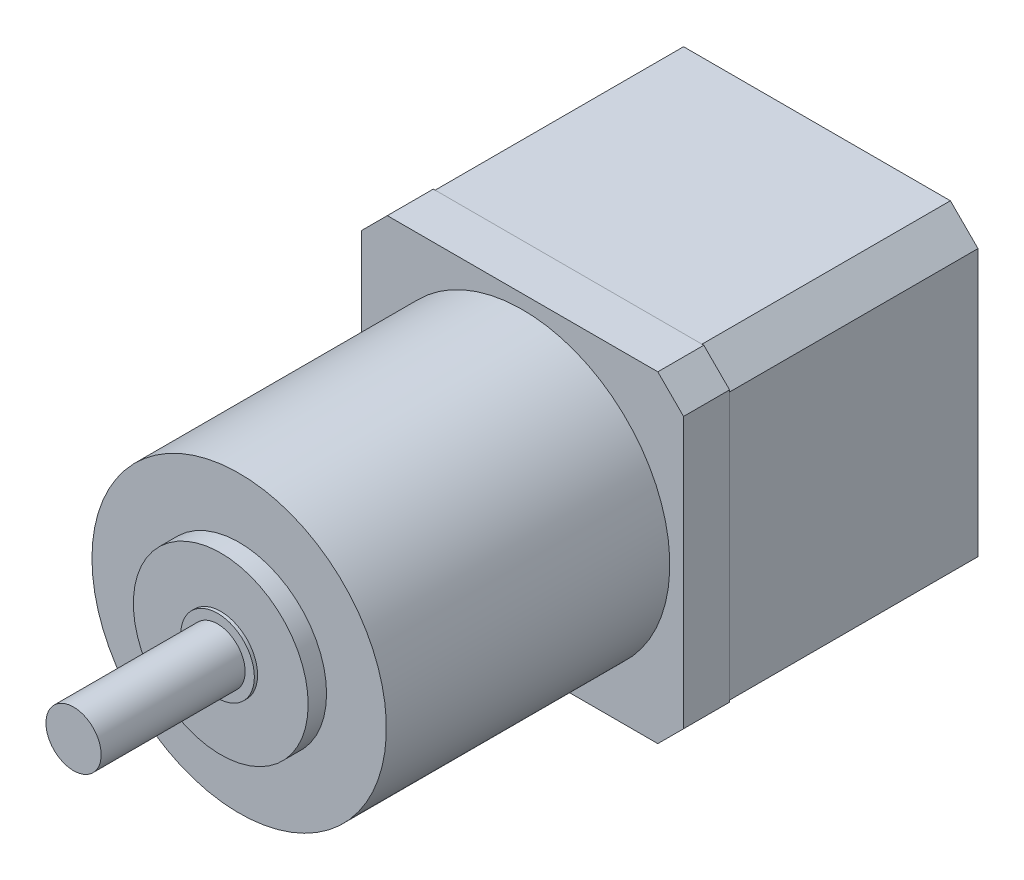
ISO-10303-21;
HEADER;
FILE_DESCRIPTION(('STEP AP214'),'2;1');
FILE_NAME('part.step','',(''),(''),'','','');
FILE_SCHEMA(('AUTOMOTIVE_DESIGN { 1 0 10303 214 1 1 1 1 }'));
ENDSEC;
DATA;
#1=APPLICATION_CONTEXT('core data for automotive mechanical design processes');
#2=APPLICATION_PROTOCOL_DEFINITION('international standard','automotive_design',2000,#1);
#3=PRODUCT_CONTEXT('',#1,'mechanical');
#4=PRODUCT('Part','Part','',(#3));
#5=PRODUCT_RELATED_PRODUCT_CATEGORY('part','',(#4));
#6=PRODUCT_DEFINITION_FORMATION('','',#4);
#7=PRODUCT_DEFINITION_CONTEXT('part definition',#1,'design');
#8=PRODUCT_DEFINITION('design','',#6,#7);
#9=PRODUCT_DEFINITION_SHAPE('','',#8);
#10=(LENGTH_UNIT() NAMED_UNIT(*) SI_UNIT(.MILLI.,.METRE.));
#11=(NAMED_UNIT(*) PLANE_ANGLE_UNIT() SI_UNIT($,.RADIAN.));
#12=(NAMED_UNIT(*) SI_UNIT($,.STERADIAN.) SOLID_ANGLE_UNIT());
#13=UNCERTAINTY_MEASURE_WITH_UNIT(LENGTH_MEASURE(1.E-05),#10,'distance_accuracy_value','');
#14=(GEOMETRIC_REPRESENTATION_CONTEXT(3) GLOBAL_UNCERTAINTY_ASSIGNED_CONTEXT((#13)) GLOBAL_UNIT_ASSIGNED_CONTEXT((#10,
#11,#12)) REPRESENTATION_CONTEXT('',''));
#15=CARTESIAN_POINT('',(0.,0.,0.));
#16=DIRECTION('',(0.,0.,1.));
#17=DIRECTION('',(1.,0.,0.));
#18=AXIS2_PLACEMENT_3D('',#15,#16,#17);
#19=CARTESIAN_POINT('',(17.5,-17.5,32.));
#20=DIRECTION('',(-1.,0.,0.));
#21=DIRECTION('',(0.,0.,1.));
#22=AXIS2_PLACEMENT_3D('',#19,#20,#21);
#23=PLANE('',#22);
#24=DIRECTION('',(0.,1.,0.));
#25=VECTOR('',#24,1.);
#26=CARTESIAN_POINT('',(17.5,-17.5,32.));
#27=LINE('',#26,#25);
#28=CARTESIAN_POINT('',(17.5,-14.7,32.));
#29=VERTEX_POINT('',#28);
#30=CARTESIAN_POINT('',(17.5,14.7,32.));
#31=VERTEX_POINT('',#30);
#32=EDGE_CURVE('E139',#29,#31,#27,.T.);
#33=ORIENTED_EDGE('',*,*,#32,.F.);
#34=DIRECTION('',(0.,0.,-1.));
#35=VECTOR('',#34,1.);
#36=CARTESIAN_POINT('',(17.5,-14.7,32.));
#37=LINE('',#36,#35);
#38=CARTESIAN_POINT('',(17.5,-14.7,27.));
#39=VERTEX_POINT('',#38);
#40=EDGE_CURVE('E165',#29,#39,#37,.T.);
#41=ORIENTED_EDGE('',*,*,#40,.T.);
#42=DIRECTION('',(0.,1.,0.));
#43=VECTOR('',#42,1.);
#44=CARTESIAN_POINT('',(17.5,-17.5,27.));
#45=LINE('',#44,#43);
#46=CARTESIAN_POINT('',(17.5,14.7,27.));
#47=VERTEX_POINT('',#46);
#48=EDGE_CURVE('E176',#39,#47,#45,.T.);
#49=ORIENTED_EDGE('',*,*,#48,.T.);
#50=DIRECTION('',(0.,0.,1.));
#51=VECTOR('',#50,1.);
#52=CARTESIAN_POINT('',(17.5,14.7,32.));
#53=LINE('',#52,#51);
#54=EDGE_CURVE('E163',#47,#31,#53,.T.);
#55=ORIENTED_EDGE('',*,*,#54,.T.);
#56=EDGE_LOOP('',(#33,#41,#49,#55));
#57=FACE_BOUND('',#56,.T.);
#58=ADVANCED_FACE('F46',(#57),#23,.F.);
#59=CARTESIAN_POINT('',(-17.5,17.5,32.));
#60=DIRECTION('',(0.,-1.,0.));
#61=DIRECTION('',(0.,0.,-1.));
#62=AXIS2_PLACEMENT_3D('',#59,#60,#61);
#63=PLANE('',#62);
#64=DIRECTION('',(-1.,0.,0.));
#65=VECTOR('',#64,1.);
#66=CARTESIAN_POINT('',(-17.5,17.5,27.));
#67=LINE('',#66,#65);
#68=CARTESIAN_POINT('',(14.7,17.5,27.));
#69=VERTEX_POINT('',#68);
#70=CARTESIAN_POINT('',(-14.7,17.5,27.));
#71=VERTEX_POINT('',#70);
#72=EDGE_CURVE('E144',#69,#71,#67,.T.);
#73=ORIENTED_EDGE('',*,*,#72,.T.);
#74=DIRECTION('',(0.,0.,1.));
#75=VECTOR('',#74,1.);
#76=CARTESIAN_POINT('',(-14.7,17.5,32.));
#77=LINE('',#76,#75);
#78=CARTESIAN_POINT('',(-14.7,17.5,32.));
#79=VERTEX_POINT('',#78);
#80=EDGE_CURVE('E55',#71,#79,#77,.T.);
#81=ORIENTED_EDGE('',*,*,#80,.T.);
#82=DIRECTION('',(-1.,0.,0.));
#83=VECTOR('',#82,1.);
#84=CARTESIAN_POINT('',(-17.5,17.5,32.));
#85=LINE('',#84,#83);
#86=CARTESIAN_POINT('',(14.7,17.5,32.));
#87=VERTEX_POINT('',#86);
#88=EDGE_CURVE('E142',#87,#79,#85,.T.);
#89=ORIENTED_EDGE('',*,*,#88,.F.);
#90=DIRECTION('',(0.,0.,-1.));
#91=VECTOR('',#90,1.);
#92=CARTESIAN_POINT('',(14.7,17.5,32.));
#93=LINE('',#92,#91);
#94=EDGE_CURVE('E168',#87,#69,#93,.T.);
#95=ORIENTED_EDGE('',*,*,#94,.T.);
#96=EDGE_LOOP('',(#73,#81,#89,#95));
#97=FACE_BOUND('',#96,.T.);
#98=ADVANCED_FACE('F173',(#97),#63,.F.);
#99=CARTESIAN_POINT('',(-17.5,-17.5,32.));
#100=DIRECTION('',(1.,0.,0.));
#101=DIRECTION('',(0.,0.,-1.));
#102=AXIS2_PLACEMENT_3D('',#99,#100,#101);
#103=PLANE('',#102);
#104=DIRECTION('',(0.,-1.,0.));
#105=VECTOR('',#104,1.);
#106=CARTESIAN_POINT('',(-17.5,-17.5,27.));
#107=LINE('',#106,#105);
#108=CARTESIAN_POINT('',(-17.5,14.7,27.));
#109=VERTEX_POINT('',#108);
#110=CARTESIAN_POINT('',(-17.5,-14.7,27.));
#111=VERTEX_POINT('',#110);
#112=EDGE_CURVE('E140',#109,#111,#107,.T.);
#113=ORIENTED_EDGE('',*,*,#112,.T.);
#114=DIRECTION('',(0.,0.,1.));
#115=VECTOR('',#114,1.);
#116=CARTESIAN_POINT('',(-17.5,-14.7,32.));
#117=LINE('',#116,#115);
#118=CARTESIAN_POINT('',(-17.5,-14.7,32.));
#119=VERTEX_POINT('',#118);
#120=EDGE_CURVE('E118',#111,#119,#117,.T.);
#121=ORIENTED_EDGE('',*,*,#120,.T.);
#122=DIRECTION('',(0.,-1.,0.));
#123=VECTOR('',#122,1.);
#124=CARTESIAN_POINT('',(-17.5,-17.5,32.));
#125=LINE('',#124,#123);
#126=CARTESIAN_POINT('',(-17.5,14.7,32.));
#127=VERTEX_POINT('',#126);
#128=EDGE_CURVE('E181',#127,#119,#125,.T.);
#129=ORIENTED_EDGE('',*,*,#128,.F.);
#130=DIRECTION('',(0.,0.,-1.));
#131=VECTOR('',#130,1.);
#132=CARTESIAN_POINT('',(-17.5,14.7,32.));
#133=LINE('',#132,#131);
#134=EDGE_CURVE('E123',#127,#109,#133,.T.);
#135=ORIENTED_EDGE('',*,*,#134,.T.);
#136=EDGE_LOOP('',(#113,#121,#129,#135));
#137=FACE_BOUND('',#136,.T.);
#138=ADVANCED_FACE('F229',(#137),#103,.F.);
#139=CARTESIAN_POINT('',(-17.5,-17.5,32.));
#140=DIRECTION('',(0.,1.,0.));
#141=DIRECTION('',(0.,0.,1.));
#142=AXIS2_PLACEMENT_3D('',#139,#140,#141);
#143=PLANE('',#142);
#144=DIRECTION('',(1.,0.,0.));
#145=VECTOR('',#144,1.);
#146=CARTESIAN_POINT('',(-17.5,-17.5,32.));
#147=LINE('',#146,#145);
#148=CARTESIAN_POINT('',(-14.7,-17.5,32.));
#149=VERTEX_POINT('',#148);
#150=CARTESIAN_POINT('',(14.7,-17.5,32.));
#151=VERTEX_POINT('',#150);
#152=EDGE_CURVE('E133',#149,#151,#147,.T.);
#153=ORIENTED_EDGE('',*,*,#152,.F.);
#154=DIRECTION('',(0.,0.,-1.));
#155=VECTOR('',#154,1.);
#156=CARTESIAN_POINT('',(-14.7,-17.5,32.));
#157=LINE('',#156,#155);
#158=CARTESIAN_POINT('',(-14.7,-17.5,27.));
#159=VERTEX_POINT('',#158);
#160=EDGE_CURVE('E117',#149,#159,#157,.T.);
#161=ORIENTED_EDGE('',*,*,#160,.T.);
#162=DIRECTION('',(1.,0.,0.));
#163=VECTOR('',#162,1.);
#164=CARTESIAN_POINT('',(-17.5,-17.5,27.));
#165=LINE('',#164,#163);
#166=CARTESIAN_POINT('',(14.7,-17.5,27.));
#167=VERTEX_POINT('',#166);
#168=EDGE_CURVE('E130',#159,#167,#165,.T.);
#169=ORIENTED_EDGE('',*,*,#168,.T.);
#170=DIRECTION('',(0.,0.,1.));
#171=VECTOR('',#170,1.);
#172=CARTESIAN_POINT('',(14.7,-17.5,32.));
#173=LINE('',#172,#171);
#174=EDGE_CURVE('E135',#167,#151,#173,.T.);
#175=ORIENTED_EDGE('',*,*,#174,.T.);
#176=EDGE_LOOP('',(#153,#161,#169,#175));
#177=FACE_BOUND('',#176,.T.);
#178=ADVANCED_FACE('F129',(#177),#143,.F.);
#179=CARTESIAN_POINT('',(0.,0.,32.));
#180=DIRECTION('',(0.,0.,-1.));
#181=DIRECTION('',(-1.,0.,0.));
#182=AXIS2_PLACEMENT_3D('',#179,#180,#181);
#183=PLANE('',#182);
#184=CARTESIAN_POINT('',(0.,0.,32.));
#185=DIRECTION('',(0.,0.,-1.));
#186=DIRECTION('',(-1.,0.,0.));
#187=AXIS2_PLACEMENT_3D('',#184,#185,#186);
#188=CIRCLE('',#187,16.);
#189=CARTESIAN_POINT('',(-16.,0.,32.));
#190=VERTEX_POINT('',#189);
#191=EDGE_CURVE('E12',#190,#190,#188,.F.);
#192=ORIENTED_EDGE('',*,*,#191,.F.);
#193=EDGE_LOOP('',(#192));
#194=FACE_BOUND('',#193,.T.);
#195=ORIENTED_EDGE('',*,*,#128,.T.);
#196=DIRECTION('',(-0.707106781186547,0.707106781186548,0.));
#197=VECTOR('',#196,1.);
#198=CARTESIAN_POINT('',(-14.7,-17.5,32.));
#199=LINE('',#198,#197);
#200=EDGE_CURVE('E161',#119,#149,#199,.F.);
#201=ORIENTED_EDGE('',*,*,#200,.T.);
#202=ORIENTED_EDGE('',*,*,#152,.T.);
#203=DIRECTION('',(-0.707106781186548,-0.707106781186547,0.));
#204=VECTOR('',#203,1.);
#205=CARTESIAN_POINT('',(17.5,-14.7,32.));
#206=LINE('',#205,#204);
#207=EDGE_CURVE('E159',#151,#29,#206,.F.);
#208=ORIENTED_EDGE('',*,*,#207,.T.);
#209=ORIENTED_EDGE('',*,*,#32,.T.);
#210=DIRECTION('',(0.707106781186547,-0.707106781186548,0.));
#211=VECTOR('',#210,1.);
#212=CARTESIAN_POINT('',(14.7,17.5,32.));
#213=LINE('',#212,#211);
#214=EDGE_CURVE('E68',#31,#87,#213,.F.);
#215=ORIENTED_EDGE('',*,*,#214,.T.);
#216=ORIENTED_EDGE('',*,*,#88,.T.);
#217=DIRECTION('',(0.707106781186548,0.707106781186547,0.));
#218=VECTOR('',#217,1.);
#219=CARTESIAN_POINT('',(-17.5,14.7,32.));
#220=LINE('',#219,#218);
#221=EDGE_CURVE('E157',#79,#127,#220,.F.);
#222=ORIENTED_EDGE('',*,*,#221,.T.);
#223=EDGE_LOOP('',(#195,#201,#202,#208,#209,#215,#216,#222));
#224=FACE_BOUND('',#223,.T.);
#225=ADVANCED_FACE('F249',(#194,#224),#183,.F.);
#226=CARTESIAN_POINT('',(0.,0.,27.));
#227=DIRECTION('',(0.,0.,-1.));
#228=DIRECTION('',(-1.,0.,0.));
#229=AXIS2_PLACEMENT_3D('',#226,#227,#228);
#230=PLANE('',#229);
#231=ORIENTED_EDGE('',*,*,#168,.F.);
#232=DIRECTION('',(0.707106781186547,-0.707106781186548,0.));
#233=VECTOR('',#232,1.);
#234=CARTESIAN_POINT('',(-16.1,-16.1,27.));
#235=LINE('',#234,#233);
#236=EDGE_CURVE('E113',#159,#111,#235,.F.);
#237=ORIENTED_EDGE('',*,*,#236,.T.);
#238=ORIENTED_EDGE('',*,*,#112,.F.);
#239=DIRECTION('',(-0.707106781186548,-0.707106781186547,0.));
#240=VECTOR('',#239,1.);
#241=CARTESIAN_POINT('',(-16.1,16.1,27.));
#242=LINE('',#241,#240);
#243=EDGE_CURVE('E150',#109,#71,#242,.F.);
#244=ORIENTED_EDGE('',*,*,#243,.T.);
#245=ORIENTED_EDGE('',*,*,#72,.F.);
#246=DIRECTION('',(-0.707106781186547,0.707106781186548,0.));
#247=VECTOR('',#246,1.);
#248=CARTESIAN_POINT('',(16.1,16.1,27.));
#249=LINE('',#248,#247);
#250=EDGE_CURVE('E134',#69,#47,#249,.F.);
#251=ORIENTED_EDGE('',*,*,#250,.T.);
#252=ORIENTED_EDGE('',*,*,#48,.F.);
#253=DIRECTION('',(0.707106781186548,0.707106781186547,0.));
#254=VECTOR('',#253,1.);
#255=CARTESIAN_POINT('',(16.1,-16.1,27.));
#256=LINE('',#255,#254);
#257=EDGE_CURVE('E124',#39,#167,#256,.F.);
#258=ORIENTED_EDGE('',*,*,#257,.T.);
#259=EDGE_LOOP('',(#231,#237,#238,#244,#245,#251,#252,#258));
#260=FACE_BOUND('',#259,.T.);
#261=ADVANCED_FACE('F137',(#260),#230,.T.);
#262=CARTESIAN_POINT('',(-14.7,-17.5,32.));
#263=DIRECTION('',(0.707106781186548,0.707106781186547,0.));
#264=DIRECTION('',(0.,0.,-1.));
#265=AXIS2_PLACEMENT_3D('',#262,#263,#264);
#266=PLANE('',#265);
#267=ORIENTED_EDGE('',*,*,#200,.F.);
#268=ORIENTED_EDGE('',*,*,#120,.F.);
#269=ORIENTED_EDGE('',*,*,#236,.F.);
#270=ORIENTED_EDGE('',*,*,#160,.F.);
#271=EDGE_LOOP('',(#267,#268,#269,#270));
#272=FACE_BOUND('',#271,.T.);
#273=ADVANCED_FACE('F116',(#272),#266,.F.);
#274=CARTESIAN_POINT('',(17.5,-14.7,32.));
#275=DIRECTION('',(-0.707106781186547,0.707106781186548,0.));
#276=DIRECTION('',(0.,0.,-1.));
#277=AXIS2_PLACEMENT_3D('',#274,#275,#276);
#278=PLANE('',#277);
#279=ORIENTED_EDGE('',*,*,#207,.F.);
#280=ORIENTED_EDGE('',*,*,#174,.F.);
#281=ORIENTED_EDGE('',*,*,#257,.F.);
#282=ORIENTED_EDGE('',*,*,#40,.F.);
#283=EDGE_LOOP('',(#279,#280,#281,#282));
#284=FACE_BOUND('',#283,.T.);
#285=ADVANCED_FACE('F236',(#284),#278,.F.);
#286=CARTESIAN_POINT('',(-17.5,14.7,32.));
#287=DIRECTION('',(0.707106781186547,-0.707106781186548,0.));
#288=DIRECTION('',(0.,0.,-1.));
#289=AXIS2_PLACEMENT_3D('',#286,#287,#288);
#290=PLANE('',#289);
#291=ORIENTED_EDGE('',*,*,#221,.F.);
#292=ORIENTED_EDGE('',*,*,#80,.F.);
#293=ORIENTED_EDGE('',*,*,#243,.F.);
#294=ORIENTED_EDGE('',*,*,#134,.F.);
#295=EDGE_LOOP('',(#291,#292,#293,#294));
#296=FACE_BOUND('',#295,.T.);
#297=ADVANCED_FACE('F238',(#296),#290,.F.);
#298=CARTESIAN_POINT('',(14.7,17.5,32.));
#299=DIRECTION('',(-0.707106781186548,-0.707106781186547,0.));
#300=DIRECTION('',(0.,0.,-1.));
#301=AXIS2_PLACEMENT_3D('',#298,#299,#300);
#302=PLANE('',#301);
#303=ORIENTED_EDGE('',*,*,#214,.F.);
#304=ORIENTED_EDGE('',*,*,#54,.F.);
#305=ORIENTED_EDGE('',*,*,#250,.F.);
#306=ORIENTED_EDGE('',*,*,#94,.F.);
#307=EDGE_LOOP('',(#303,#304,#305,#306));
#308=FACE_BOUND('',#307,.T.);
#309=ADVANCED_FACE('F48',(#308),#302,.F.);
#310=CARTESIAN_POINT('',(0.,0.,62.8));
#311=DIRECTION('',(0.,0.,-1.));
#312=DIRECTION('',(-1.,0.,0.));
#313=AXIS2_PLACEMENT_3D('',#310,#311,#312);
#314=CYLINDRICAL_SURFACE('',#313,16.);
#315=CARTESIAN_POINT('',(0.,0.,62.8));
#316=DIRECTION('',(0.,0.,1.));
#317=DIRECTION('',(1.,0.,0.));
#318=AXIS2_PLACEMENT_3D('',#315,#316,#317);
#319=CIRCLE('',#318,16.);
#320=CARTESIAN_POINT('',(-16.,0.,62.8));
#321=VERTEX_POINT('',#320);
#322=EDGE_CURVE('E177',#321,#321,#319,.T.);
#323=CARTESIAN_POINT('',(-16.,0.,62.8));
#324=CARTESIAN_POINT('',(-16.,0.,62.4791666666667));
#325=CARTESIAN_POINT('',(-16.,0.,62.1583333333333));
#326=CARTESIAN_POINT('',(-16.,0.,61.5166666666667));
#327=CARTESIAN_POINT('',(-16.,0.,61.1958333333333));
#328=CARTESIAN_POINT('',(-16.,0.,60.5541666666667));
#329=CARTESIAN_POINT('',(-16.,0.,60.2333333333333));
#330=CARTESIAN_POINT('',(-16.,0.,59.5916666666667));
#331=CARTESIAN_POINT('',(-16.,0.,59.2708333333333));
#332=CARTESIAN_POINT('',(-16.,0.,58.6291666666667));
#333=CARTESIAN_POINT('',(-16.,0.,58.3083333333333));
#334=CARTESIAN_POINT('',(-16.,0.,57.6666666666667));
#335=CARTESIAN_POINT('',(-16.,0.,57.3458333333333));
#336=CARTESIAN_POINT('',(-16.,0.,56.7041666666667));
#337=CARTESIAN_POINT('',(-16.,0.,56.3833333333333));
#338=CARTESIAN_POINT('',(-16.,0.,55.7416666666667));
#339=CARTESIAN_POINT('',(-16.,0.,55.4208333333333));
#340=CARTESIAN_POINT('',(-16.,0.,54.7791666666667));
#341=CARTESIAN_POINT('',(-16.,0.,54.4583333333333));
#342=CARTESIAN_POINT('',(-16.,0.,53.8166666666667));
#343=CARTESIAN_POINT('',(-16.,0.,53.4958333333333));
#344=CARTESIAN_POINT('',(-16.,0.,52.8541666666667));
#345=CARTESIAN_POINT('',(-16.,0.,52.5333333333333));
#346=CARTESIAN_POINT('',(-16.,0.,51.8916666666667));
#347=CARTESIAN_POINT('',(-16.,0.,51.5708333333333));
#348=CARTESIAN_POINT('',(-16.,0.,50.9291666666667));
#349=CARTESIAN_POINT('',(-16.,0.,50.6083333333333));
#350=CARTESIAN_POINT('',(-16.,0.,49.9666666666667));
#351=CARTESIAN_POINT('',(-16.,0.,49.6458333333333));
#352=CARTESIAN_POINT('',(-16.,0.,49.0041666666667));
#353=CARTESIAN_POINT('',(-16.,0.,48.6833333333333));
#354=CARTESIAN_POINT('',(-16.,0.,48.0416666666667));
#355=CARTESIAN_POINT('',(-16.,0.,47.7208333333333));
#356=CARTESIAN_POINT('',(-16.,0.,47.0791666666667));
#357=CARTESIAN_POINT('',(-16.,0.,46.7583333333333));
#358=CARTESIAN_POINT('',(-16.,0.,46.1166666666667));
#359=CARTESIAN_POINT('',(-16.,0.,45.7958333333333));
#360=CARTESIAN_POINT('',(-16.,0.,45.1541666666667));
#361=CARTESIAN_POINT('',(-16.,0.,44.8333333333333));
#362=CARTESIAN_POINT('',(-16.,0.,44.1916666666667));
#363=CARTESIAN_POINT('',(-16.,0.,43.8708333333333));
#364=CARTESIAN_POINT('',(-16.,0.,43.2291666666667));
#365=CARTESIAN_POINT('',(-16.,0.,42.9083333333333));
#366=CARTESIAN_POINT('',(-16.,0.,42.2666666666667));
#367=CARTESIAN_POINT('',(-16.,0.,41.9458333333333));
#368=CARTESIAN_POINT('',(-16.,0.,41.3041666666667));
#369=CARTESIAN_POINT('',(-16.,0.,40.9833333333333));
#370=CARTESIAN_POINT('',(-16.,0.,40.3416666666667));
#371=CARTESIAN_POINT('',(-16.,0.,40.0208333333333));
#372=CARTESIAN_POINT('',(-16.,0.,39.3791666666667));
#373=CARTESIAN_POINT('',(-16.,0.,39.0583333333333));
#374=CARTESIAN_POINT('',(-16.,0.,38.4166666666667));
#375=CARTESIAN_POINT('',(-16.,0.,38.0958333333333));
#376=CARTESIAN_POINT('',(-16.,0.,37.4541666666667));
#377=CARTESIAN_POINT('',(-16.,0.,37.1333333333333));
#378=CARTESIAN_POINT('',(-16.,0.,36.4916666666667));
#379=CARTESIAN_POINT('',(-16.,0.,36.1708333333333));
#380=CARTESIAN_POINT('',(-16.,0.,35.5291666666667));
#381=CARTESIAN_POINT('',(-16.,0.,35.2083333333333));
#382=CARTESIAN_POINT('',(-16.,0.,34.5666666666667));
#383=CARTESIAN_POINT('',(-16.,0.,34.2458333333333));
#384=CARTESIAN_POINT('',(-16.,0.,33.6041666666667));
#385=CARTESIAN_POINT('',(-16.,0.,33.2833333333333));
#386=CARTESIAN_POINT('',(-16.,0.,32.6416666666667));
#387=CARTESIAN_POINT('',(-16.,0.,32.3208333333333));
#388=CARTESIAN_POINT('',(-16.,0.,32.));
#389=B_SPLINE_CURVE_WITH_KNOTS('',3,(#323,#324,#325,#326,#327,#328,#329,#330,#331,#332,#333,
#334,#335,#336,#337,#338,#339,#340,#341,#342,#343,#344,#345,#346,#347,#348,#349,#350,#351,#352,
#353,#354,#355,#356,#357,#358,#359,#360,#361,#362,#363,#364,#365,#366,#367,#368,#369,#370,#371,
#372,#373,#374,#375,#376,#377,#378,#379,#380,#381,#382,#383,#384,#385,#386,#387,#388),
.UNSPECIFIED.,.F.,.F.,(4,2,2,2,2,2,2,2,2,2,2,2,2,2,2,2,2,2,2,2,2,2,2,2,2,2,2,2,2,2,2,2,4),(0.,
0.962500000000005,1.925,2.88750000000001,3.85000000000001,4.8125,5.775,6.7375,7.70000000000001,
8.6625,9.625,10.5875,11.55,12.5125,13.475,14.4375,15.4,16.3625,17.325,18.2875,19.25,20.2125,
21.175,22.1375,23.1,24.0625,25.025,25.9875,26.95,27.9125,28.875,29.8375,30.8),.UNSPECIFIED.);
#390=EDGE_CURVE('BSEAM245',#321,#190,#389,.T.);
#391=ORIENTED_EDGE('',*,*,#322,.F.);
#392=ORIENTED_EDGE('',*,*,#191,.T.);
#393=ORIENTED_EDGE('',*,*,#390,.T.);
#394=ORIENTED_EDGE('',*,*,#390,.F.);
#395=EDGE_LOOP('',(#391,#393,#392,#394));
#396=FACE_BOUND('',#395,.T.);
#397=ADVANCED_FACE('F245',(#396),#314,.T.);
#398=CARTESIAN_POINT('',(0.,0.,62.8));
#399=DIRECTION('',(0.,0.,1.));
#400=DIRECTION('',(1.,0.,0.));
#401=AXIS2_PLACEMENT_3D('',#398,#399,#400);
#402=PLANE('',#401);
#403=CARTESIAN_POINT('',(0.,0.,62.8));
#404=DIRECTION('',(0.,0.,1.));
#405=DIRECTION('',(1.,0.,0.));
#406=AXIS2_PLACEMENT_3D('',#403,#404,#405);
#407=CIRCLE('',#406,9.5);
#408=CARTESIAN_POINT('',(9.5,0.,62.8));
#409=VERTEX_POINT('',#408);
#410=EDGE_CURVE('E188',#409,#409,#407,.T.);
#411=ORIENTED_EDGE('',*,*,#410,.F.);
#412=EDGE_LOOP('',(#411));
#413=FACE_BOUND('',#412,.T.);
#414=ORIENTED_EDGE('',*,*,#322,.T.);
#415=EDGE_LOOP('',(#414));
#416=FACE_BOUND('',#415,.T.);
#417=ADVANCED_FACE('F264',(#413,#416),#402,.T.);
#418=CARTESIAN_POINT('',(0.,0.,64.8));
#419=DIRECTION('',(0.,0.,-1.));
#420=DIRECTION('',(-1.,0.,0.));
#421=AXIS2_PLACEMENT_3D('',#418,#419,#420);
#422=CYLINDRICAL_SURFACE('',#421,9.5);
#423=CARTESIAN_POINT('',(0.,0.,64.8));
#424=DIRECTION('',(0.,0.,1.));
#425=DIRECTION('',(1.,0.,0.));
#426=AXIS2_PLACEMENT_3D('',#423,#424,#425);
#427=CIRCLE('',#426,9.5);
#428=CARTESIAN_POINT('',(9.5,0.,64.8));
#429=VERTEX_POINT('',#428);
#430=EDGE_CURVE('E187',#429,#429,#427,.T.);
#431=ORIENTED_EDGE('',*,*,#430,.F.);
#432=EDGE_LOOP('',(#431));
#433=FACE_BOUND('',#432,.T.);
#434=ORIENTED_EDGE('',*,*,#410,.T.);
#435=EDGE_LOOP('',(#434));
#436=FACE_BOUND('',#435,.T.);
#437=ADVANCED_FACE('F268',(#433,#436),#422,.T.);
#438=CARTESIAN_POINT('',(0.,0.,64.8));
#439=DIRECTION('',(0.,0.,1.));
#440=DIRECTION('',(1.,0.,0.));
#441=AXIS2_PLACEMENT_3D('',#438,#439,#440);
#442=PLANE('',#441);
#443=CARTESIAN_POINT('',(0.,0.,64.8));
#444=DIRECTION('',(0.,0.,1.));
#445=DIRECTION('',(1.,0.,0.));
#446=AXIS2_PLACEMENT_3D('',#443,#444,#445);
#447=CIRCLE('',#446,4.);
#448=CARTESIAN_POINT('',(4.,0.,64.8));
#449=VERTEX_POINT('',#448);
#450=EDGE_CURVE('E196',#449,#449,#447,.T.);
#451=ORIENTED_EDGE('',*,*,#450,.F.);
#452=EDGE_LOOP('',(#451));
#453=FACE_BOUND('',#452,.T.);
#454=ORIENTED_EDGE('',*,*,#430,.T.);
#455=EDGE_LOOP('',(#454));
#456=FACE_BOUND('',#455,.T.);
#457=ADVANCED_FACE('F220',(#453,#456),#442,.T.);
#458=CARTESIAN_POINT('',(0.,0.,65.15));
#459=DIRECTION('',(0.,0.,-1.));
#460=DIRECTION('',(-1.,0.,0.));
#461=AXIS2_PLACEMENT_3D('',#458,#459,#460);
#462=CYLINDRICAL_SURFACE('',#461,4.);
#463=CARTESIAN_POINT('',(0.,0.,65.15));
#464=DIRECTION('',(0.,0.,1.));
#465=DIRECTION('',(1.,0.,0.));
#466=AXIS2_PLACEMENT_3D('',#463,#464,#465);
#467=CIRCLE('',#466,4.);
#468=CARTESIAN_POINT('',(4.,0.,65.15));
#469=VERTEX_POINT('',#468);
#470=EDGE_CURVE('E199',#469,#469,#467,.T.);
#471=ORIENTED_EDGE('',*,*,#470,.F.);
#472=EDGE_LOOP('',(#471));
#473=FACE_BOUND('',#472,.T.);
#474=ORIENTED_EDGE('',*,*,#450,.T.);
#475=EDGE_LOOP('',(#474));
#476=FACE_BOUND('',#475,.T.);
#477=ADVANCED_FACE('F212',(#473,#476),#462,.T.);
#478=CARTESIAN_POINT('',(0.,0.,65.15));
#479=DIRECTION('',(0.,0.,1.));
#480=DIRECTION('',(1.,0.,0.));
#481=AXIS2_PLACEMENT_3D('',#478,#479,#480);
#482=PLANE('',#481);
#483=CARTESIAN_POINT('',(0.,0.,65.15));
#484=DIRECTION('',(0.,0.,1.));
#485=DIRECTION('',(1.,0.,0.));
#486=AXIS2_PLACEMENT_3D('',#483,#484,#485);
#487=CIRCLE('',#486,3.);
#488=CARTESIAN_POINT('',(3.,0.,65.15));
#489=VERTEX_POINT('',#488);
#490=EDGE_CURVE('E50',#489,#489,#487,.T.);
#491=ORIENTED_EDGE('',*,*,#490,.F.);
#492=EDGE_LOOP('',(#491));
#493=FACE_BOUND('',#492,.T.);
#494=ORIENTED_EDGE('',*,*,#470,.T.);
#495=EDGE_LOOP('',(#494));
#496=FACE_BOUND('',#495,.T.);
#497=ADVANCED_FACE('F209',(#493,#496),#482,.T.);
#498=CARTESIAN_POINT('',(0.,0.,80.8));
#499=DIRECTION('',(0.,0.,1.));
#500=DIRECTION('',(1.,0.,0.));
#501=AXIS2_PLACEMENT_3D('',#498,#499,#500);
#502=PLANE('',#501);
#503=CARTESIAN_POINT('',(0.,0.,80.8));
#504=DIRECTION('',(0.,0.,1.));
#505=DIRECTION('',(1.,0.,0.));
#506=AXIS2_PLACEMENT_3D('',#503,#504,#505);
#507=CIRCLE('',#506,3.);
#508=CARTESIAN_POINT('',(3.,0.,80.8));
#509=VERTEX_POINT('',#508);
#510=EDGE_CURVE('E191',#509,#509,#507,.T.);
#511=ORIENTED_EDGE('',*,*,#510,.T.);
#512=EDGE_LOOP('',(#511));
#513=FACE_BOUND('',#512,.T.);
#514=ADVANCED_FACE('F211',(#513),#502,.T.);
#515=CARTESIAN_POINT('',(0.,0.,80.8));
#516=DIRECTION('',(0.,0.,-1.));
#517=DIRECTION('',(-1.,0.,0.));
#518=AXIS2_PLACEMENT_3D('',#515,#516,#517);
#519=CYLINDRICAL_SURFACE('',#518,3.);
#520=ORIENTED_EDGE('',*,*,#490,.T.);
#521=EDGE_LOOP('',(#520));
#522=FACE_BOUND('',#521,.T.);
#523=ORIENTED_EDGE('',*,*,#510,.F.);
#524=EDGE_LOOP('',(#523));
#525=FACE_BOUND('',#524,.T.);
#526=ADVANCED_FACE('F206',(#522,#525),#519,.T.);
#527=CLOSED_SHELL('',(#58,#98,#138,#178,#225,#261,#273,#285,#297,#309,#397,#417,#437,#457,#477,
#497,#514,#526));
#528=MANIFOLD_SOLID_BREP('B2',#527);
#529=CARTESIAN_POINT('',(17.5,17.5,27.));
#530=DIRECTION('',(-1.,0.,0.));
#531=DIRECTION('',(0.,-1.,0.));
#532=AXIS2_PLACEMENT_3D('',#529,#530,#531);
#533=PLANE('',#532);
#534=DIRECTION('',(0.,1.,0.));
#535=VECTOR('',#534,1.);
#536=CARTESIAN_POINT('',(17.5,17.5,27.));
#537=LINE('',#536,#535);
#538=CARTESIAN_POINT('',(17.5,-14.5,27.));
#539=VERTEX_POINT('',#538);
#540=CARTESIAN_POINT('',(17.5,14.5,27.));
#541=VERTEX_POINT('',#540);
#542=EDGE_CURVE('E492',#539,#541,#537,.T.);
#543=ORIENTED_EDGE('',*,*,#542,.F.);
#544=DIRECTION('',(0.,0.,-1.));
#545=VECTOR('',#544,1.);
#546=CARTESIAN_POINT('',(17.5,-14.5,27.));
#547=LINE('',#546,#545);
#548=CARTESIAN_POINT('',(17.5,-14.5,0.));
#549=VERTEX_POINT('',#548);
#550=EDGE_CURVE('E518',#539,#549,#547,.T.);
#551=ORIENTED_EDGE('',*,*,#550,.T.);
#552=DIRECTION('',(0.,1.,0.));
#553=VECTOR('',#552,1.);
#554=CARTESIAN_POINT('',(17.5,17.5,0.));
#555=LINE('',#554,#553);
#556=CARTESIAN_POINT('',(17.5,14.5,0.));
#557=VERTEX_POINT('',#556);
#558=EDGE_CURVE('E526',#549,#557,#555,.T.);
#559=ORIENTED_EDGE('',*,*,#558,.T.);
#560=DIRECTION('',(0.,0.,1.));
#561=VECTOR('',#560,1.);
#562=CARTESIAN_POINT('',(17.5,14.5,27.));
#563=LINE('',#562,#561);
#564=EDGE_CURVE('E516',#557,#541,#563,.T.);
#565=ORIENTED_EDGE('',*,*,#564,.T.);
#566=EDGE_LOOP('',(#543,#551,#559,#565));
#567=FACE_BOUND('',#566,.T.);
#568=ADVANCED_FACE('F401',(#567),#533,.F.);
#569=CARTESIAN_POINT('',(-17.5,17.5,27.));
#570=DIRECTION('',(0.,-1.,0.));
#571=DIRECTION('',(0.,0.,-1.));
#572=AXIS2_PLACEMENT_3D('',#569,#570,#571);
#573=PLANE('',#572);
#574=DIRECTION('',(-1.,0.,0.));
#575=VECTOR('',#574,1.);
#576=CARTESIAN_POINT('',(-17.5,17.5,0.));
#577=LINE('',#576,#575);
#578=CARTESIAN_POINT('',(14.5,17.5,0.));
#579=VERTEX_POINT('',#578);
#580=CARTESIAN_POINT('',(-14.5,17.5,0.));
#581=VERTEX_POINT('',#580);
#582=EDGE_CURVE('E497',#579,#581,#577,.T.);
#583=ORIENTED_EDGE('',*,*,#582,.T.);
#584=DIRECTION('',(0.,0.,1.));
#585=VECTOR('',#584,1.);
#586=CARTESIAN_POINT('',(-14.5,17.5,27.));
#587=LINE('',#586,#585);
#588=CARTESIAN_POINT('',(-14.5,17.5,27.));
#589=VERTEX_POINT('',#588);
#590=EDGE_CURVE('E44',#581,#589,#587,.T.);
#591=ORIENTED_EDGE('',*,*,#590,.T.);
#592=DIRECTION('',(-1.,0.,0.));
#593=VECTOR('',#592,1.);
#594=CARTESIAN_POINT('',(-17.5,17.5,27.));
#595=LINE('',#594,#593);
#596=CARTESIAN_POINT('',(14.5,17.5,27.));
#597=VERTEX_POINT('',#596);
#598=EDGE_CURVE('E495',#597,#589,#595,.T.);
#599=ORIENTED_EDGE('',*,*,#598,.F.);
#600=DIRECTION('',(0.,0.,-1.));
#601=VECTOR('',#600,1.);
#602=CARTESIAN_POINT('',(14.5,17.5,27.));
#603=LINE('',#602,#601);
#604=EDGE_CURVE('E409',#597,#579,#603,.T.);
#605=ORIENTED_EDGE('',*,*,#604,.T.);
#606=EDGE_LOOP('',(#583,#591,#599,#605));
#607=FACE_BOUND('',#606,.T.);
#608=ADVANCED_FACE('F523',(#607),#573,.F.);
#609=CARTESIAN_POINT('',(-17.5,17.5,27.));
#610=DIRECTION('',(1.,0.,0.));
#611=DIRECTION('',(0.,1.,0.));
#612=AXIS2_PLACEMENT_3D('',#609,#610,#611);
#613=PLANE('',#612);
#614=DIRECTION('',(0.,-1.,0.));
#615=VECTOR('',#614,1.);
#616=CARTESIAN_POINT('',(-17.5,17.5,0.));
#617=LINE('',#616,#615);
#618=CARTESIAN_POINT('',(-17.5,14.5,0.));
#619=VERTEX_POINT('',#618);
#620=CARTESIAN_POINT('',(-17.5,-14.5,0.));
#621=VERTEX_POINT('',#620);
#622=EDGE_CURVE('E493',#619,#621,#617,.T.);
#623=ORIENTED_EDGE('',*,*,#622,.T.);
#624=DIRECTION('',(0.,0.,1.));
#625=VECTOR('',#624,1.);
#626=CARTESIAN_POINT('',(-17.5,-14.5,27.));
#627=LINE('',#626,#625);
#628=CARTESIAN_POINT('',(-17.5,-14.5,27.));
#629=VERTEX_POINT('',#628);
#630=EDGE_CURVE('E471',#621,#629,#627,.T.);
#631=ORIENTED_EDGE('',*,*,#630,.T.);
#632=DIRECTION('',(0.,-1.,0.));
#633=VECTOR('',#632,1.);
#634=CARTESIAN_POINT('',(-17.5,17.5,27.));
#635=LINE('',#634,#633);
#636=CARTESIAN_POINT('',(-17.5,14.5,27.));
#637=VERTEX_POINT('',#636);
#638=EDGE_CURVE('E530',#637,#629,#635,.T.);
#639=ORIENTED_EDGE('',*,*,#638,.F.);
#640=DIRECTION('',(0.,0.,-1.));
#641=VECTOR('',#640,1.);
#642=CARTESIAN_POINT('',(-17.5,14.5,27.));
#643=LINE('',#642,#641);
#644=EDGE_CURVE('E476',#637,#619,#643,.T.);
#645=ORIENTED_EDGE('',*,*,#644,.T.);
#646=EDGE_LOOP('',(#623,#631,#639,#645));
#647=FACE_BOUND('',#646,.T.);
#648=ADVANCED_FACE('F540',(#647),#613,.F.);
#649=CARTESIAN_POINT('',(-17.5,-17.5,27.));
#650=DIRECTION('',(0.,1.,0.));
#651=DIRECTION('',(0.,0.,1.));
#652=AXIS2_PLACEMENT_3D('',#649,#650,#651);
#653=PLANE('',#652);
#654=DIRECTION('',(1.,0.,0.));
#655=VECTOR('',#654,1.);
#656=CARTESIAN_POINT('',(-17.5,-17.5,27.));
#657=LINE('',#656,#655);
#658=CARTESIAN_POINT('',(-14.5,-17.5,27.));
#659=VERTEX_POINT('',#658);
#660=CARTESIAN_POINT('',(14.5,-17.5,27.));
#661=VERTEX_POINT('',#660);
#662=EDGE_CURVE('E486',#659,#661,#657,.T.);
#663=ORIENTED_EDGE('',*,*,#662,.F.);
#664=DIRECTION('',(0.,0.,-1.));
#665=VECTOR('',#664,1.);
#666=CARTESIAN_POINT('',(-14.5,-17.5,27.));
#667=LINE('',#666,#665);
#668=CARTESIAN_POINT('',(-14.5,-17.5,0.));
#669=VERTEX_POINT('',#668);
#670=EDGE_CURVE('E470',#659,#669,#667,.T.);
#671=ORIENTED_EDGE('',*,*,#670,.T.);
#672=DIRECTION('',(1.,0.,0.));
#673=VECTOR('',#672,1.);
#674=CARTESIAN_POINT('',(-17.5,-17.5,0.));
#675=LINE('',#674,#673);
#676=CARTESIAN_POINT('',(14.5,-17.5,0.));
#677=VERTEX_POINT('',#676);
#678=EDGE_CURVE('E483',#669,#677,#675,.T.);
#679=ORIENTED_EDGE('',*,*,#678,.T.);
#680=DIRECTION('',(0.,0.,1.));
#681=VECTOR('',#680,1.);
#682=CARTESIAN_POINT('',(14.5,-17.5,27.));
#683=LINE('',#682,#681);
#684=EDGE_CURVE('E488',#677,#661,#683,.T.);
#685=ORIENTED_EDGE('',*,*,#684,.T.);
#686=EDGE_LOOP('',(#663,#671,#679,#685));
#687=FACE_BOUND('',#686,.T.);
#688=ADVANCED_FACE('F482',(#687),#653,.F.);
#689=CARTESIAN_POINT('',(0.,0.,27.));
#690=DIRECTION('',(0.,0.,1.));
#691=DIRECTION('',(1.,0.,0.));
#692=AXIS2_PLACEMENT_3D('',#689,#690,#691);
#693=PLANE('',#692);
#694=ORIENTED_EDGE('',*,*,#638,.T.);
#695=DIRECTION('',(-0.707106781186547,0.707106781186548,0.));
#696=VECTOR('',#695,1.);
#697=CARTESIAN_POINT('',(-16.,-16.,27.));
#698=LINE('',#697,#696);
#699=EDGE_CURVE('E514',#629,#659,#698,.F.);
#700=ORIENTED_EDGE('',*,*,#699,.T.);
#701=ORIENTED_EDGE('',*,*,#662,.T.);
#702=DIRECTION('',(-0.70710678118655,-0.707106781186546,0.));
#703=VECTOR('',#702,1.);
#704=CARTESIAN_POINT('',(16.,-16.,27.));
#705=LINE('',#704,#703);
#706=EDGE_CURVE('E512',#661,#539,#705,.F.);
#707=ORIENTED_EDGE('',*,*,#706,.T.);
#708=ORIENTED_EDGE('',*,*,#542,.T.);
#709=DIRECTION('',(0.707106781186547,-0.707106781186548,0.));
#710=VECTOR('',#709,1.);
#711=CARTESIAN_POINT('',(16.,16.,27.));
#712=LINE('',#711,#710);
#713=EDGE_CURVE('E421',#541,#597,#712,.F.);
#714=ORIENTED_EDGE('',*,*,#713,.T.);
#715=ORIENTED_EDGE('',*,*,#598,.T.);
#716=DIRECTION('',(0.707106781186548,0.707106781186547,0.));
#717=VECTOR('',#716,1.);
#718=CARTESIAN_POINT('',(-16.,16.,27.));
#719=LINE('',#718,#717);
#720=EDGE_CURVE('E510',#589,#637,#719,.F.);
#721=ORIENTED_EDGE('',*,*,#720,.T.);
#722=EDGE_LOOP('',(#694,#700,#701,#707,#708,#714,#715,#721));
#723=FACE_BOUND('',#722,.T.);
#724=ADVANCED_FACE('F534',(#723),#693,.T.);
#725=CARTESIAN_POINT('',(0.,0.,0.));
#726=DIRECTION('',(0.,0.,1.));
#727=DIRECTION('',(1.,0.,0.));
#728=AXIS2_PLACEMENT_3D('',#725,#726,#727);
#729=PLANE('',#728);
#730=ORIENTED_EDGE('',*,*,#678,.F.);
#731=DIRECTION('',(0.707106781186547,-0.707106781186548,0.));
#732=VECTOR('',#731,1.);
#733=CARTESIAN_POINT('',(-14.5,-17.5,0.));
#734=LINE('',#733,#732);
#735=EDGE_CURVE('E466',#669,#621,#734,.F.);
#736=ORIENTED_EDGE('',*,*,#735,.T.);
#737=ORIENTED_EDGE('',*,*,#622,.F.);
#738=DIRECTION('',(-0.707106781186548,-0.707106781186547,0.));
#739=VECTOR('',#738,1.);
#740=CARTESIAN_POINT('',(-17.5,14.5,0.));
#741=LINE('',#740,#739);
#742=EDGE_CURVE('E503',#619,#581,#741,.F.);
#743=ORIENTED_EDGE('',*,*,#742,.T.);
#744=ORIENTED_EDGE('',*,*,#582,.F.);
#745=DIRECTION('',(-0.707106781186547,0.707106781186548,0.));
#746=VECTOR('',#745,1.);
#747=CARTESIAN_POINT('',(14.5,17.5,0.));
#748=LINE('',#747,#746);
#749=EDGE_CURVE('E487',#579,#557,#748,.F.);
#750=ORIENTED_EDGE('',*,*,#749,.T.);
#751=ORIENTED_EDGE('',*,*,#558,.F.);
#752=DIRECTION('',(0.70710678118655,0.707106781186546,0.));
#753=VECTOR('',#752,1.);
#754=CARTESIAN_POINT('',(17.5,-14.5,0.));
#755=LINE('',#754,#753);
#756=EDGE_CURVE('E477',#549,#677,#755,.F.);
#757=ORIENTED_EDGE('',*,*,#756,.T.);
#758=EDGE_LOOP('',(#730,#736,#737,#743,#744,#750,#751,#757));
#759=FACE_BOUND('',#758,.T.);
#760=ADVANCED_FACE('F490',(#759),#729,.F.);
#761=CARTESIAN_POINT('',(-14.5,-17.5,27.));
#762=DIRECTION('',(0.707106781186548,0.707106781186547,0.));
#763=DIRECTION('',(0.,0.,-1.));
#764=AXIS2_PLACEMENT_3D('',#761,#762,#763);
#765=PLANE('',#764);
#766=ORIENTED_EDGE('',*,*,#699,.F.);
#767=ORIENTED_EDGE('',*,*,#630,.F.);
#768=ORIENTED_EDGE('',*,*,#735,.F.);
#769=ORIENTED_EDGE('',*,*,#670,.F.);
#770=EDGE_LOOP('',(#766,#767,#768,#769));
#771=FACE_BOUND('',#770,.T.);
#772=ADVANCED_FACE('F469',(#771),#765,.F.);
#773=CARTESIAN_POINT('',(17.5,-14.5,27.));
#774=DIRECTION('',(-0.707106781186546,0.70710678118655,0.));
#775=DIRECTION('',(0.,0.,-1.));
#776=AXIS2_PLACEMENT_3D('',#773,#774,#775);
#777=PLANE('',#776);
#778=ORIENTED_EDGE('',*,*,#706,.F.);
#779=ORIENTED_EDGE('',*,*,#684,.F.);
#780=ORIENTED_EDGE('',*,*,#756,.F.);
#781=ORIENTED_EDGE('',*,*,#550,.F.);
#782=EDGE_LOOP('',(#778,#779,#780,#781));
#783=FACE_BOUND('',#782,.T.);
#784=ADVANCED_FACE('F545',(#783),#777,.F.);
#785=CARTESIAN_POINT('',(-17.5,14.5,27.));
#786=DIRECTION('',(0.707106781186547,-0.707106781186548,0.));
#787=DIRECTION('',(0.,0.,-1.));
#788=AXIS2_PLACEMENT_3D('',#785,#786,#787);
#789=PLANE('',#788);
#790=ORIENTED_EDGE('',*,*,#720,.F.);
#791=ORIENTED_EDGE('',*,*,#590,.F.);
#792=ORIENTED_EDGE('',*,*,#742,.F.);
#793=ORIENTED_EDGE('',*,*,#644,.F.);
#794=EDGE_LOOP('',(#790,#791,#792,#793));
#795=FACE_BOUND('',#794,.T.);
#796=ADVANCED_FACE('F538',(#795),#789,.F.);
#797=CARTESIAN_POINT('',(14.5,17.5,27.));
#798=DIRECTION('',(-0.707106781186548,-0.707106781186547,0.));
#799=DIRECTION('',(0.,0.,-1.));
#800=AXIS2_PLACEMENT_3D('',#797,#798,#799);
#801=PLANE('',#800);
#802=ORIENTED_EDGE('',*,*,#713,.F.);
#803=ORIENTED_EDGE('',*,*,#564,.F.);
#804=ORIENTED_EDGE('',*,*,#749,.F.);
#805=ORIENTED_EDGE('',*,*,#604,.F.);
#806=EDGE_LOOP('',(#802,#803,#804,#805));
#807=FACE_BOUND('',#806,.T.);
#808=ADVANCED_FACE('F403',(#807),#801,.F.);
#809=CLOSED_SHELL('',(#568,#608,#648,#688,#724,#760,#772,#784,#796,#808));
#810=MANIFOLD_SOLID_BREP('B6',#809);
#811=ADVANCED_BREP_SHAPE_REPRESENTATION('',(#18,#528,#810),#14);
#812=SHAPE_DEFINITION_REPRESENTATION(#9,#811);
ENDSEC;
END-ISO-10303-21;
